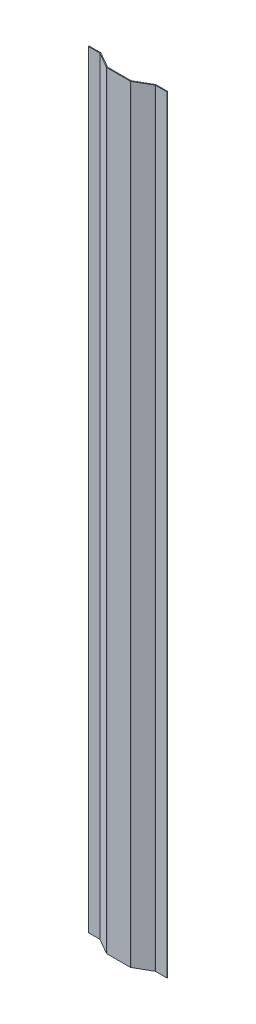
ISO-10303-21;
HEADER;
FILE_DESCRIPTION(('STEP AP214'),'2;1');
FILE_NAME('part.step','',(''),(''),'','','');
FILE_SCHEMA(('AUTOMOTIVE_DESIGN { 1 0 10303 214 1 1 1 1 }'));
ENDSEC;
DATA;
#1=APPLICATION_CONTEXT('core data for automotive mechanical design processes');
#2=APPLICATION_PROTOCOL_DEFINITION('international standard','automotive_design',2000,#1);
#3=PRODUCT_CONTEXT('',#1,'mechanical');
#4=PRODUCT('Part','Part','',(#3));
#5=PRODUCT_RELATED_PRODUCT_CATEGORY('part','',(#4));
#6=PRODUCT_DEFINITION_FORMATION('','',#4);
#7=PRODUCT_DEFINITION_CONTEXT('part definition',#1,'design');
#8=PRODUCT_DEFINITION('design','',#6,#7);
#9=PRODUCT_DEFINITION_SHAPE('','',#8);
#10=(LENGTH_UNIT() NAMED_UNIT(*) SI_UNIT(.MILLI.,.METRE.));
#11=(NAMED_UNIT(*) PLANE_ANGLE_UNIT() SI_UNIT($,.RADIAN.));
#12=(NAMED_UNIT(*) SI_UNIT($,.STERADIAN.) SOLID_ANGLE_UNIT());
#13=UNCERTAINTY_MEASURE_WITH_UNIT(LENGTH_MEASURE(1.E-05),#10,'distance_accuracy_value','');
#14=(GEOMETRIC_REPRESENTATION_CONTEXT(3) GLOBAL_UNCERTAINTY_ASSIGNED_CONTEXT((#13)) GLOBAL_UNIT_ASSIGNED_CONTEXT((#10,
#11,#12)) REPRESENTATION_CONTEXT('',''));
#15=CARTESIAN_POINT('',(0.,0.,0.));
#16=DIRECTION('',(0.,0.,1.));
#17=DIRECTION('',(1.,0.,0.));
#18=AXIS2_PLACEMENT_3D('',#15,#16,#17);
#19=CARTESIAN_POINT('',(29.7990381056767,0.,0.));
#20=DIRECTION('',(0.,-1.,0.));
#21=DIRECTION('',(0.,0.,-1.));
#22=AXIS2_PLACEMENT_3D('',#19,#20,#21);
#23=PLANE('',#22);
#24=DIRECTION('',(0.,0.,1.));
#25=VECTOR('',#24,1.);
#26=CARTESIAN_POINT('',(29.7990381056767,0.,0.));
#27=LINE('',#26,#25);
#28=CARTESIAN_POINT('',(29.7990381056767,0.,0.));
#29=VERTEX_POINT('',#28);
#30=CARTESIAN_POINT('',(29.7990381056767,0.,2.));
#31=VERTEX_POINT('',#30);
#32=EDGE_CURVE('E11',#29,#31,#27,.T.);
#33=ORIENTED_EDGE('',*,*,#32,.F.);
#34=CARTESIAN_POINT('',(29.7990381056767,0.,-0.749999999999998));
#35=DIRECTION('',(0.,-1.,0.));
#36=DIRECTION('',(0.,0.,-1.));
#37=AXIS2_PLACEMENT_3D('',#34,#35,#36);
#38=CIRCLE('',#37,0.75);
#39=CARTESIAN_POINT('',(30.1740381056767,0.,-0.100480947161669));
#40=VERTEX_POINT('',#39);
#41=EDGE_CURVE('E342',#29,#40,#38,.F.);
#42=ORIENTED_EDGE('',*,*,#41,.T.);
#43=DIRECTION('',(-0.500000000000001,0.,-0.866025403784438));
#44=VECTOR('',#43,1.);
#45=CARTESIAN_POINT('',(31.1740381056767,0.,1.63156986040721));
#46=LINE('',#45,#44);
#47=CARTESIAN_POINT('',(31.1740381056767,0.,1.63156986040721));
#48=VERTEX_POINT('',#47);
#49=EDGE_CURVE('E44',#48,#40,#46,.T.);
#50=ORIENTED_EDGE('',*,*,#49,.F.);
#51=CARTESIAN_POINT('',(29.7990381056767,0.,-0.749999999999998));
#52=DIRECTION('',(0.,1.,0.));
#53=DIRECTION('',(1.,0.,0.));
#54=AXIS2_PLACEMENT_3D('',#51,#52,#53);
#55=CIRCLE('',#54,2.75);
#56=EDGE_CURVE('E351',#31,#48,#55,.T.);
#57=ORIENTED_EDGE('',*,*,#56,.F.);
#58=EDGE_LOOP('',(#33,#42,#50,#57));
#59=FACE_BOUND('',#58,.T.);
#60=ADVANCED_FACE('F37',(#59),#23,.T.);
#61=CARTESIAN_POINT('',(31.1740381056767,0.,1.63156986040721));
#62=DIRECTION('',(0.,-1.,0.));
#63=DIRECTION('',(0.,0.,-1.));
#64=AXIS2_PLACEMENT_3D('',#61,#62,#63);
#65=PLANE('',#64);
#66=DIRECTION('',(1.,0.,0.));
#67=VECTOR('',#66,1.);
#68=CARTESIAN_POINT('',(0.,0.,0.));
#69=LINE('',#68,#67);
#70=CARTESIAN_POINT('',(-29.7990381056767,0.,0.));
#71=VERTEX_POINT('',#70);
#72=EDGE_CURVE('E345',#71,#29,#69,.T.);
#73=ORIENTED_EDGE('',*,*,#72,.T.);
#74=ORIENTED_EDGE('',*,*,#32,.T.);
#75=DIRECTION('',(1.,0.,0.));
#76=VECTOR('',#75,1.);
#77=CARTESIAN_POINT('',(0.,0.,2.));
#78=LINE('',#77,#76);
#79=CARTESIAN_POINT('',(-29.7990381056767,0.,2.));
#80=VERTEX_POINT('',#79);
#81=EDGE_CURVE('E348',#80,#31,#78,.T.);
#82=ORIENTED_EDGE('',*,*,#81,.F.);
#83=DIRECTION('',(0.,0.,1.));
#84=VECTOR('',#83,1.);
#85=CARTESIAN_POINT('',(-29.7990381056767,0.,0.));
#86=LINE('',#85,#84);
#87=EDGE_CURVE('E326',#71,#80,#86,.T.);
#88=ORIENTED_EDGE('',*,*,#87,.F.);
#89=EDGE_LOOP('',(#73,#74,#82,#88));
#90=FACE_BOUND('',#89,.T.);
#91=ADVANCED_FACE('F457',(#90),#65,.T.);
#92=CARTESIAN_POINT('',(69.1990288532697,0.,-22.6315698604072));
#93=DIRECTION('',(0.,-1.,0.));
#94=DIRECTION('',(0.,0.,-1.));
#95=AXIS2_PLACEMENT_3D('',#92,#93,#94);
#96=PLANE('',#95);
#97=DIRECTION('',(0.500000000000002,0.,0.866025403784438));
#98=VECTOR('',#97,1.);
#99=CARTESIAN_POINT('',(69.1990288532697,0.,-22.6315698604072));
#100=LINE('',#99,#98);
#101=CARTESIAN_POINT('',(69.1990288532697,0.,-22.6315698604072));
#102=VERTEX_POINT('',#101);
#103=CARTESIAN_POINT('',(70.1990288532697,0.,-20.8995190528383));
#104=VERTEX_POINT('',#103);
#105=EDGE_CURVE('E59',#102,#104,#100,.T.);
#106=ORIENTED_EDGE('',*,*,#105,.F.);
#107=CARTESIAN_POINT('',(70.5740288532697,0.,-20.25));
#108=DIRECTION('',(0.,1.,0.));
#109=DIRECTION('',(0.,0.,1.));
#110=AXIS2_PLACEMENT_3D('',#107,#108,#109);
#111=CIRCLE('',#110,2.75);
#112=CARTESIAN_POINT('',(70.5740288532697,0.,-23.));
#113=VERTEX_POINT('',#112);
#114=EDGE_CURVE('E338',#102,#113,#111,.F.);
#115=ORIENTED_EDGE('',*,*,#114,.T.);
#116=DIRECTION('',(0.,0.,-1.));
#117=VECTOR('',#116,1.);
#118=CARTESIAN_POINT('',(70.5740288532697,0.,-21.));
#119=LINE('',#118,#117);
#120=CARTESIAN_POINT('',(70.5740288532697,0.,-21.));
#121=VERTEX_POINT('',#120);
#122=EDGE_CURVE('E51',#121,#113,#119,.T.);
#123=ORIENTED_EDGE('',*,*,#122,.F.);
#124=CARTESIAN_POINT('',(70.5740288532697,0.,-20.25));
#125=DIRECTION('',(0.,1.,0.));
#126=DIRECTION('',(1.,0.,0.));
#127=AXIS2_PLACEMENT_3D('',#124,#125,#126);
#128=CIRCLE('',#127,0.75);
#129=EDGE_CURVE('E357',#104,#121,#128,.F.);
#130=ORIENTED_EDGE('',*,*,#129,.F.);
#131=EDGE_LOOP('',(#106,#115,#123,#130));
#132=FACE_BOUND('',#131,.T.);
#133=ADVANCED_FACE('F430',(#132),#96,.T.);
#134=CARTESIAN_POINT('',(70.5740288532697,0.,-21.));
#135=DIRECTION('',(0.,-1.,0.));
#136=DIRECTION('',(0.,0.,-1.));
#137=AXIS2_PLACEMENT_3D('',#134,#135,#136);
#138=PLANE('',#137);
#139=DIRECTION('',(0.866025403784438,0.,-0.500000000000001));
#140=VECTOR('',#139,1.);
#141=CARTESIAN_POINT('',(30.,0.,0.));
#142=LINE('',#141,#140);
#143=EDGE_CURVE('E340',#40,#102,#142,.T.);
#144=ORIENTED_EDGE('',*,*,#143,.T.);
#145=ORIENTED_EDGE('',*,*,#105,.T.);
#146=DIRECTION('',(0.866025403784438,0.,-0.500000000000001));
#147=VECTOR('',#146,1.);
#148=CARTESIAN_POINT('',(31.,0.,1.73205080756888));
#149=LINE('',#148,#147);
#150=EDGE_CURVE('E354',#48,#104,#149,.T.);
#151=ORIENTED_EDGE('',*,*,#150,.F.);
#152=ORIENTED_EDGE('',*,*,#49,.T.);
#153=EDGE_LOOP('',(#144,#145,#151,#152));
#154=FACE_BOUND('',#153,.T.);
#155=ADVANCED_FACE('F387',(#154),#138,.T.);
#156=CARTESIAN_POINT('',(69.8371685740841,1077.91967853083,-21.));
#157=DIRECTION('',(0.,0.,-1.));
#158=DIRECTION('',(-1.,0.,0.));
#159=AXIS2_PLACEMENT_3D('',#156,#157,#158);
#160=PLANE('',#159);
#161=DIRECTION('',(0.,-1.,0.));
#162=VECTOR('',#161,1.);
#163=CARTESIAN_POINT('',(99.8371685740841,1077.91967853083,-21.));
#164=LINE('',#163,#162);
#165=CARTESIAN_POINT('',(99.8371685740841,1950.,-21.));
#166=VERTEX_POINT('',#165);
#167=CARTESIAN_POINT('',(99.8371685740841,0.,-21.));
#168=VERTEX_POINT('',#167);
#169=EDGE_CURVE('E384',#166,#168,#164,.T.);
#170=ORIENTED_EDGE('',*,*,#169,.F.);
#171=DIRECTION('',(1.,0.,0.));
#172=VECTOR('',#171,1.);
#173=CARTESIAN_POINT('',(69.8371685740841,1950.,-21.));
#174=LINE('',#173,#172);
#175=CARTESIAN_POINT('',(70.5740288532697,1950.,-21.));
#176=VERTEX_POINT('',#175);
#177=EDGE_CURVE('E231',#176,#166,#174,.T.);
#178=ORIENTED_EDGE('',*,*,#177,.F.);
#179=DIRECTION('',(0.,-1.,0.));
#180=VECTOR('',#179,1.);
#181=CARTESIAN_POINT('',(70.5740288532697,1077.91967853083,-21.));
#182=LINE('',#181,#180);
#183=EDGE_CURVE('E360',#176,#121,#182,.T.);
#184=ORIENTED_EDGE('',*,*,#183,.T.);
#185=DIRECTION('',(1.,0.,0.));
#186=VECTOR('',#185,1.);
#187=CARTESIAN_POINT('',(69.8371685740841,0.,-21.));
#188=LINE('',#187,#186);
#189=EDGE_CURVE('E329',#121,#168,#188,.T.);
#190=ORIENTED_EDGE('',*,*,#189,.T.);
#191=EDGE_LOOP('',(#170,#178,#184,#190));
#192=FACE_BOUND('',#191,.T.);
#193=ADVANCED_FACE('F439',(#192),#160,.F.);
#194=CARTESIAN_POINT('',(99.8371685740841,1077.91967853083,-23.));
#195=DIRECTION('',(1.,0.,0.));
#196=DIRECTION('',(0.,0.,-1.));
#197=AXIS2_PLACEMENT_3D('',#194,#195,#196);
#198=PLANE('',#197);
#199=DIRECTION('',(0.,-1.,0.));
#200=VECTOR('',#199,1.);
#201=CARTESIAN_POINT('',(99.8371685740841,1077.91967853083,-23.));
#202=LINE('',#201,#200);
#203=CARTESIAN_POINT('',(99.8371685740841,1950.,-23.));
#204=VERTEX_POINT('',#203);
#205=CARTESIAN_POINT('',(99.8371685740841,0.,-23.));
#206=VERTEX_POINT('',#205);
#207=EDGE_CURVE('E382',#204,#206,#202,.T.);
#208=ORIENTED_EDGE('',*,*,#207,.F.);
#209=DIRECTION('',(0.,0.,1.));
#210=VECTOR('',#209,1.);
#211=CARTESIAN_POINT('',(99.8371685740841,1950.,-23.));
#212=LINE('',#211,#210);
#213=EDGE_CURVE('E234',#204,#166,#212,.T.);
#214=ORIENTED_EDGE('',*,*,#213,.T.);
#215=ORIENTED_EDGE('',*,*,#169,.T.);
#216=DIRECTION('',(0.,0.,1.));
#217=VECTOR('',#216,1.);
#218=CARTESIAN_POINT('',(99.8371685740841,0.,-23.));
#219=LINE('',#218,#217);
#220=EDGE_CURVE('E332',#206,#168,#219,.T.);
#221=ORIENTED_EDGE('',*,*,#220,.F.);
#222=EDGE_LOOP('',(#208,#214,#215,#221));
#223=FACE_BOUND('',#222,.T.);
#224=ADVANCED_FACE('F447',(#223),#198,.T.);
#225=CARTESIAN_POINT('',(69.8371685740841,1077.91967853083,-23.));
#226=DIRECTION('',(0.,0.,-1.));
#227=DIRECTION('',(-1.,0.,0.));
#228=AXIS2_PLACEMENT_3D('',#225,#226,#227);
#229=PLANE('',#228);
#230=DIRECTION('',(0.,-1.,0.));
#231=VECTOR('',#230,1.);
#232=CARTESIAN_POINT('',(70.5740288532697,1077.91967853083,-23.));
#233=LINE('',#232,#231);
#234=CARTESIAN_POINT('',(70.5740288532697,1950.,-23.));
#235=VERTEX_POINT('',#234);
#236=EDGE_CURVE('E379',#235,#113,#233,.T.);
#237=ORIENTED_EDGE('',*,*,#236,.F.);
#238=DIRECTION('',(1.,0.,0.));
#239=VECTOR('',#238,1.);
#240=CARTESIAN_POINT('',(69.8371685740841,1950.,-23.));
#241=LINE('',#240,#239);
#242=EDGE_CURVE('E237',#235,#204,#241,.T.);
#243=ORIENTED_EDGE('',*,*,#242,.T.);
#244=ORIENTED_EDGE('',*,*,#207,.T.);
#245=DIRECTION('',(1.,0.,0.));
#246=VECTOR('',#245,1.);
#247=CARTESIAN_POINT('',(69.8371685740841,0.,-23.));
#248=LINE('',#247,#246);
#249=EDGE_CURVE('E335',#113,#206,#248,.T.);
#250=ORIENTED_EDGE('',*,*,#249,.F.);
#251=EDGE_LOOP('',(#237,#243,#244,#250));
#252=FACE_BOUND('',#251,.T.);
#253=ADVANCED_FACE('F445',(#252),#229,.T.);
#254=CARTESIAN_POINT('',(70.5740288532697,1077.91967853083,-20.25));
#255=DIRECTION('',(0.,-1.,0.));
#256=DIRECTION('',(0.,0.,-1.));
#257=AXIS2_PLACEMENT_3D('',#254,#255,#256);
#258=CYLINDRICAL_SURFACE('',#257,2.75);
#259=DIRECTION('',(0.,-1.,0.));
#260=VECTOR('',#259,1.);
#261=CARTESIAN_POINT('',(69.1990288532697,1077.91967853083,-22.6315698604072));
#262=LINE('',#261,#260);
#263=CARTESIAN_POINT('',(69.1990288532697,1950.,-22.6315698604072));
#264=VERTEX_POINT('',#263);
#265=EDGE_CURVE('E376',#264,#102,#262,.T.);
#266=ORIENTED_EDGE('',*,*,#265,.F.);
#267=CARTESIAN_POINT('',(70.5740288532697,1950.,-20.25));
#268=DIRECTION('',(0.,1.,0.));
#269=DIRECTION('',(0.,0.,1.));
#270=AXIS2_PLACEMENT_3D('',#267,#268,#269);
#271=CIRCLE('',#270,2.75);
#272=EDGE_CURVE('E240',#264,#235,#271,.F.);
#273=ORIENTED_EDGE('',*,*,#272,.T.);
#274=ORIENTED_EDGE('',*,*,#236,.T.);
#275=ORIENTED_EDGE('',*,*,#114,.F.);
#276=EDGE_LOOP('',(#266,#273,#274,#275));
#277=FACE_BOUND('',#276,.T.);
#278=ADVANCED_FACE('F428',(#277),#258,.T.);
#279=CARTESIAN_POINT('',(30.,1077.91967853083,0.));
#280=DIRECTION('',(-0.500000000000001,0.,-0.866025403784438));
#281=DIRECTION('',(-0.866025403784438,0.,0.500000000000001));
#282=AXIS2_PLACEMENT_3D('',#279,#280,#281);
#283=PLANE('',#282);
#284=DIRECTION('',(0.,-1.,0.));
#285=VECTOR('',#284,1.);
#286=CARTESIAN_POINT('',(30.1740381056767,1077.91967853083,-0.100480947161669));
#287=LINE('',#286,#285);
#288=CARTESIAN_POINT('',(30.1740381056767,1950.,-0.100480947161669));
#289=VERTEX_POINT('',#288);
#290=EDGE_CURVE('E373',#289,#40,#287,.T.);
#291=ORIENTED_EDGE('',*,*,#290,.F.);
#292=DIRECTION('',(0.866025403784438,0.,-0.500000000000001));
#293=VECTOR('',#292,1.);
#294=CARTESIAN_POINT('',(30.,1950.,0.));
#295=LINE('',#294,#293);
#296=EDGE_CURVE('E243',#289,#264,#295,.T.);
#297=ORIENTED_EDGE('',*,*,#296,.T.);
#298=ORIENTED_EDGE('',*,*,#265,.T.);
#299=ORIENTED_EDGE('',*,*,#143,.F.);
#300=EDGE_LOOP('',(#291,#297,#298,#299));
#301=FACE_BOUND('',#300,.T.);
#302=ADVANCED_FACE('F397',(#301),#283,.T.);
#303=CARTESIAN_POINT('',(29.7990381056767,1077.91967853083,-0.749999999999998));
#304=DIRECTION('',(0.,-1.,0.));
#305=DIRECTION('',(0.,0.,-1.));
#306=AXIS2_PLACEMENT_3D('',#303,#304,#305);
#307=CYLINDRICAL_SURFACE('',#306,0.75);
#308=DIRECTION('',(0.,-1.,0.));
#309=VECTOR('',#308,1.);
#310=CARTESIAN_POINT('',(29.7990381056767,1077.91967853083,0.));
#311=LINE('',#310,#309);
#312=CARTESIAN_POINT('',(29.7990381056767,1950.,0.));
#313=VERTEX_POINT('',#312);
#314=EDGE_CURVE('E370',#313,#29,#311,.T.);
#315=ORIENTED_EDGE('',*,*,#314,.F.);
#316=CARTESIAN_POINT('',(29.7990381056767,1950.,-0.749999999999998));
#317=DIRECTION('',(0.,-1.,0.));
#318=DIRECTION('',(0.,0.,-1.));
#319=AXIS2_PLACEMENT_3D('',#316,#317,#318);
#320=CIRCLE('',#319,0.75);
#321=EDGE_CURVE('E246',#313,#289,#320,.F.);
#322=ORIENTED_EDGE('',*,*,#321,.T.);
#323=ORIENTED_EDGE('',*,*,#290,.T.);
#324=ORIENTED_EDGE('',*,*,#41,.F.);
#325=EDGE_LOOP('',(#315,#322,#323,#324));
#326=FACE_BOUND('',#325,.T.);
#327=ADVANCED_FACE('F393',(#326),#307,.F.);
#328=CARTESIAN_POINT('',(0.,1077.91967853083,0.));
#329=DIRECTION('',(0.,0.,-1.));
#330=DIRECTION('',(-1.,0.,0.));
#331=AXIS2_PLACEMENT_3D('',#328,#329,#330);
#332=PLANE('',#331);
#333=ORIENTED_EDGE('',*,*,#72,.F.);
#334=DIRECTION('',(0.,-1.,0.));
#335=VECTOR('',#334,1.);
#336=CARTESIAN_POINT('',(-29.7990381056767,1077.91967853083,0.));
#337=LINE('',#336,#335);
#338=CARTESIAN_POINT('',(-29.7990381056767,1950.,0.));
#339=VERTEX_POINT('',#338);
#340=EDGE_CURVE('E307',#339,#71,#337,.T.);
#341=ORIENTED_EDGE('',*,*,#340,.F.);
#342=DIRECTION('',(1.,0.,0.));
#343=VECTOR('',#342,1.);
#344=CARTESIAN_POINT('',(0.,1950.,0.));
#345=LINE('',#344,#343);
#346=EDGE_CURVE('E249',#339,#313,#345,.T.);
#347=ORIENTED_EDGE('',*,*,#346,.T.);
#348=ORIENTED_EDGE('',*,*,#314,.T.);
#349=EDGE_LOOP('',(#333,#341,#347,#348));
#350=FACE_BOUND('',#349,.T.);
#351=ADVANCED_FACE('F401',(#350),#332,.T.);
#352=CARTESIAN_POINT('',(0.,1077.91967853083,2.));
#353=DIRECTION('',(0.,0.,-1.));
#354=DIRECTION('',(-1.,0.,0.));
#355=AXIS2_PLACEMENT_3D('',#352,#353,#354);
#356=PLANE('',#355);
#357=DIRECTION('',(0.,-1.,0.));
#358=VECTOR('',#357,1.);
#359=CARTESIAN_POINT('',(29.7990381056767,1077.91967853083,2.));
#360=LINE('',#359,#358);
#361=CARTESIAN_POINT('',(29.7990381056767,1950.,2.));
#362=VERTEX_POINT('',#361);
#363=EDGE_CURVE('E367',#362,#31,#360,.T.);
#364=ORIENTED_EDGE('',*,*,#363,.F.);
#365=DIRECTION('',(1.,0.,0.));
#366=VECTOR('',#365,1.);
#367=CARTESIAN_POINT('',(0.,1950.,2.));
#368=LINE('',#367,#366);
#369=CARTESIAN_POINT('',(-29.7990381056767,1950.,2.));
#370=VERTEX_POINT('',#369);
#371=EDGE_CURVE('E252',#370,#362,#368,.T.);
#372=ORIENTED_EDGE('',*,*,#371,.F.);
#373=DIRECTION('',(0.,-1.,0.));
#374=VECTOR('',#373,1.);
#375=CARTESIAN_POINT('',(-29.7990381056767,1077.91967853083,2.));
#376=LINE('',#375,#374);
#377=EDGE_CURVE('E304',#370,#80,#376,.T.);
#378=ORIENTED_EDGE('',*,*,#377,.T.);
#379=ORIENTED_EDGE('',*,*,#81,.T.);
#380=EDGE_LOOP('',(#364,#372,#378,#379));
#381=FACE_BOUND('',#380,.T.);
#382=ADVANCED_FACE('F533',(#381),#356,.F.);
#383=CARTESIAN_POINT('',(29.7990381056767,1077.91967853083,-0.749999999999998));
#384=DIRECTION('',(0.,-1.,0.));
#385=DIRECTION('',(0.,0.,-1.));
#386=AXIS2_PLACEMENT_3D('',#383,#384,#385);
#387=CYLINDRICAL_SURFACE('',#386,2.75);
#388=DIRECTION('',(0.,-1.,0.));
#389=VECTOR('',#388,1.);
#390=CARTESIAN_POINT('',(31.1740381056767,1077.91967853083,1.63156986040721));
#391=LINE('',#390,#389);
#392=CARTESIAN_POINT('',(31.1740381056767,1950.,1.63156986040721));
#393=VERTEX_POINT('',#392);
#394=EDGE_CURVE('E364',#393,#48,#391,.T.);
#395=ORIENTED_EDGE('',*,*,#394,.F.);
#396=CARTESIAN_POINT('',(29.7990381056767,1950.,-0.749999999999998));
#397=DIRECTION('',(0.,1.,0.));
#398=DIRECTION('',(1.,0.,0.));
#399=AXIS2_PLACEMENT_3D('',#396,#397,#398);
#400=CIRCLE('',#399,2.75);
#401=EDGE_CURVE('E255',#362,#393,#400,.T.);
#402=ORIENTED_EDGE('',*,*,#401,.F.);
#403=ORIENTED_EDGE('',*,*,#363,.T.);
#404=ORIENTED_EDGE('',*,*,#56,.T.);
#405=EDGE_LOOP('',(#395,#402,#403,#404));
#406=FACE_BOUND('',#405,.T.);
#407=ADVANCED_FACE('F415',(#406),#387,.T.);
#408=CARTESIAN_POINT('',(31.,1077.91967853083,1.73205080756888));
#409=DIRECTION('',(-0.500000000000001,0.,-0.866025403784438));
#410=DIRECTION('',(-0.866025403784438,0.,0.500000000000001));
#411=AXIS2_PLACEMENT_3D('',#408,#409,#410);
#412=PLANE('',#411);
#413=DIRECTION('',(0.,-1.,0.));
#414=VECTOR('',#413,1.);
#415=CARTESIAN_POINT('',(70.1990288532697,1077.91967853083,-20.8995190528383));
#416=LINE('',#415,#414);
#417=CARTESIAN_POINT('',(70.1990288532697,1950.,-20.8995190528383));
#418=VERTEX_POINT('',#417);
#419=EDGE_CURVE('E362',#418,#104,#416,.T.);
#420=ORIENTED_EDGE('',*,*,#419,.F.);
#421=DIRECTION('',(0.866025403784438,0.,-0.500000000000001));
#422=VECTOR('',#421,1.);
#423=CARTESIAN_POINT('',(31.,1950.,1.73205080756888));
#424=LINE('',#423,#422);
#425=EDGE_CURVE('E258',#393,#418,#424,.T.);
#426=ORIENTED_EDGE('',*,*,#425,.F.);
#427=ORIENTED_EDGE('',*,*,#394,.T.);
#428=ORIENTED_EDGE('',*,*,#150,.T.);
#429=EDGE_LOOP('',(#420,#426,#427,#428));
#430=FACE_BOUND('',#429,.T.);
#431=ADVANCED_FACE('F418',(#430),#412,.F.);
#432=CARTESIAN_POINT('',(70.5740288532697,1077.91967853083,-20.25));
#433=DIRECTION('',(0.,-1.,0.));
#434=DIRECTION('',(0.,0.,-1.));
#435=AXIS2_PLACEMENT_3D('',#432,#433,#434);
#436=CYLINDRICAL_SURFACE('',#435,0.75);
#437=ORIENTED_EDGE('',*,*,#183,.F.);
#438=CARTESIAN_POINT('',(70.5740288532697,1950.,-20.25));
#439=DIRECTION('',(0.,1.,0.));
#440=DIRECTION('',(1.,0.,0.));
#441=AXIS2_PLACEMENT_3D('',#438,#439,#440);
#442=CIRCLE('',#441,0.75);
#443=EDGE_CURVE('E261',#418,#176,#442,.F.);
#444=ORIENTED_EDGE('',*,*,#443,.F.);
#445=ORIENTED_EDGE('',*,*,#419,.T.);
#446=ORIENTED_EDGE('',*,*,#129,.T.);
#447=EDGE_LOOP('',(#437,#444,#445,#446));
#448=FACE_BOUND('',#447,.T.);
#449=ADVANCED_FACE('F433',(#448),#436,.F.);
#450=CARTESIAN_POINT('',(70.5740288532697,0.,-20.25));
#451=DIRECTION('',(0.,1.,0.));
#452=DIRECTION('',(1.,0.,0.));
#453=AXIS2_PLACEMENT_3D('',#450,#451,#452);
#454=PLANE('',#453);
#455=ORIENTED_EDGE('',*,*,#189,.F.);
#456=ORIENTED_EDGE('',*,*,#122,.T.);
#457=ORIENTED_EDGE('',*,*,#249,.T.);
#458=ORIENTED_EDGE('',*,*,#220,.T.);
#459=EDGE_LOOP('',(#455,#456,#457,#458));
#460=FACE_BOUND('',#459,.T.);
#461=ADVANCED_FACE('F436',(#460),#454,.F.);
#462=CARTESIAN_POINT('',(-29.7990381056767,0.,0.));
#463=DIRECTION('',(0.,-1.,0.));
#464=DIRECTION('',(0.,0.,-1.));
#465=AXIS2_PLACEMENT_3D('',#462,#463,#464);
#466=PLANE('',#465);
#467=ORIENTED_EDGE('',*,*,#87,.T.);
#468=CARTESIAN_POINT('',(-29.7990381056767,0.,-0.749999999999998));
#469=DIRECTION('',(0.,-1.,0.));
#470=DIRECTION('',(-1.,0.,0.));
#471=AXIS2_PLACEMENT_3D('',#468,#469,#470);
#472=CIRCLE('',#471,2.75);
#473=CARTESIAN_POINT('',(-31.1740381056767,0.,1.63156986040721));
#474=VERTEX_POINT('',#473);
#475=EDGE_CURVE('E290',#80,#474,#472,.T.);
#476=ORIENTED_EDGE('',*,*,#475,.T.);
#477=DIRECTION('',(0.500000000000001,0.,-0.866025403784438));
#478=VECTOR('',#477,1.);
#479=CARTESIAN_POINT('',(-31.1740381056767,0.,1.63156986040721));
#480=LINE('',#479,#478);
#481=CARTESIAN_POINT('',(-30.1740381056767,0.,-0.100480947161669));
#482=VERTEX_POINT('',#481);
#483=EDGE_CURVE('E323',#474,#482,#480,.T.);
#484=ORIENTED_EDGE('',*,*,#483,.T.);
#485=CARTESIAN_POINT('',(-29.7990381056767,0.,-0.749999999999998));
#486=DIRECTION('',(0.,1.,0.));
#487=DIRECTION('',(0.,0.,-1.));
#488=AXIS2_PLACEMENT_3D('',#485,#486,#487);
#489=CIRCLE('',#488,0.75);
#490=EDGE_CURVE('E287',#71,#482,#489,.F.);
#491=ORIENTED_EDGE('',*,*,#490,.F.);
#492=EDGE_LOOP('',(#467,#476,#484,#491));
#493=FACE_BOUND('',#492,.T.);
#494=ADVANCED_FACE('F765',(#493),#466,.T.);
#495=CARTESIAN_POINT('',(-69.1990288532697,0.,-22.6315698604072));
#496=DIRECTION('',(0.,-1.,0.));
#497=DIRECTION('',(0.,0.,-1.));
#498=AXIS2_PLACEMENT_3D('',#495,#496,#497);
#499=PLANE('',#498);
#500=DIRECTION('',(-0.500000000000002,0.,0.866025403784438));
#501=VECTOR('',#500,1.);
#502=CARTESIAN_POINT('',(-69.1990288532697,0.,-22.6315698604072));
#503=LINE('',#502,#501);
#504=CARTESIAN_POINT('',(-69.1990288532697,0.,-22.6315698604072));
#505=VERTEX_POINT('',#504);
#506=CARTESIAN_POINT('',(-70.1990288532697,0.,-20.8995190528383));
#507=VERTEX_POINT('',#506);
#508=EDGE_CURVE('E320',#505,#507,#503,.T.);
#509=ORIENTED_EDGE('',*,*,#508,.T.);
#510=CARTESIAN_POINT('',(-70.5740288532697,0.,-20.25));
#511=DIRECTION('',(0.,-1.,0.));
#512=DIRECTION('',(-1.,0.,0.));
#513=AXIS2_PLACEMENT_3D('',#510,#511,#512);
#514=CIRCLE('',#513,0.75);
#515=CARTESIAN_POINT('',(-70.5740288532697,0.,-21.));
#516=VERTEX_POINT('',#515);
#517=EDGE_CURVE('E296',#507,#516,#514,.F.);
#518=ORIENTED_EDGE('',*,*,#517,.T.);
#519=DIRECTION('',(0.,0.,-1.));
#520=VECTOR('',#519,1.);
#521=CARTESIAN_POINT('',(-70.5740288532697,0.,-21.));
#522=LINE('',#521,#520);
#523=CARTESIAN_POINT('',(-70.5740288532697,0.,-23.));
#524=VERTEX_POINT('',#523);
#525=EDGE_CURVE('E185',#516,#524,#522,.T.);
#526=ORIENTED_EDGE('',*,*,#525,.T.);
#527=CARTESIAN_POINT('',(-70.5740288532697,0.,-20.25));
#528=DIRECTION('',(0.,-1.,0.));
#529=DIRECTION('',(0.,0.,1.));
#530=AXIS2_PLACEMENT_3D('',#527,#528,#529);
#531=CIRCLE('',#530,2.75);
#532=EDGE_CURVE('E281',#505,#524,#531,.F.);
#533=ORIENTED_EDGE('',*,*,#532,.F.);
#534=EDGE_LOOP('',(#509,#518,#526,#533));
#535=FACE_BOUND('',#534,.T.);
#536=ADVANCED_FACE('F761',(#535),#499,.T.);
#537=CARTESIAN_POINT('',(-70.5740288532697,0.,-21.));
#538=DIRECTION('',(0.,-1.,0.));
#539=DIRECTION('',(0.,0.,-1.));
#540=AXIS2_PLACEMENT_3D('',#537,#538,#539);
#541=PLANE('',#540);
#542=DIRECTION('',(-0.866025403784438,0.,-0.500000000000001));
#543=VECTOR('',#542,1.);
#544=CARTESIAN_POINT('',(-30.,0.,0.));
#545=LINE('',#544,#543);
#546=EDGE_CURVE('E284',#482,#505,#545,.T.);
#547=ORIENTED_EDGE('',*,*,#546,.F.);
#548=ORIENTED_EDGE('',*,*,#483,.F.);
#549=DIRECTION('',(-0.866025403784438,0.,-0.500000000000001));
#550=VECTOR('',#549,1.);
#551=CARTESIAN_POINT('',(-31.,0.,1.73205080756888));
#552=LINE('',#551,#550);
#553=EDGE_CURVE('E293',#474,#507,#552,.T.);
#554=ORIENTED_EDGE('',*,*,#553,.T.);
#555=ORIENTED_EDGE('',*,*,#508,.F.);
#556=EDGE_LOOP('',(#547,#548,#554,#555));
#557=FACE_BOUND('',#556,.T.);
#558=ADVANCED_FACE('F581',(#557),#541,.T.);
#559=CARTESIAN_POINT('',(-69.8371685740841,1077.91967853083,-21.));
#560=DIRECTION('',(0.,0.,-1.));
#561=DIRECTION('',(1.,0.,0.));
#562=AXIS2_PLACEMENT_3D('',#559,#560,#561);
#563=PLANE('',#562);
#564=DIRECTION('',(0.,-1.,0.));
#565=VECTOR('',#564,1.);
#566=CARTESIAN_POINT('',(-70.5740288532697,1077.91967853083,-21.));
#567=LINE('',#566,#565);
#568=CARTESIAN_POINT('',(-70.5740288532697,1950.,-21.));
#569=VERTEX_POINT('',#568);
#570=EDGE_CURVE('E199',#569,#516,#567,.T.);
#571=ORIENTED_EDGE('',*,*,#570,.F.);
#572=DIRECTION('',(-1.,0.,0.));
#573=VECTOR('',#572,1.);
#574=CARTESIAN_POINT('',(-69.8371685740841,1950.,-21.));
#575=LINE('',#574,#573);
#576=CARTESIAN_POINT('',(-99.8371685740841,1950.,-21.));
#577=VERTEX_POINT('',#576);
#578=EDGE_CURVE('E193',#569,#577,#575,.T.);
#579=ORIENTED_EDGE('',*,*,#578,.T.);
#580=DIRECTION('',(0.,-1.,0.));
#581=VECTOR('',#580,1.);
#582=CARTESIAN_POINT('',(-99.8371685740841,1077.91967853083,-21.));
#583=LINE('',#582,#581);
#584=CARTESIAN_POINT('',(-99.8371685740841,0.,-21.));
#585=VERTEX_POINT('',#584);
#586=EDGE_CURVE('E174',#577,#585,#583,.T.);
#587=ORIENTED_EDGE('',*,*,#586,.T.);
#588=DIRECTION('',(-1.,0.,0.));
#589=VECTOR('',#588,1.);
#590=CARTESIAN_POINT('',(-69.8371685740841,0.,-21.));
#591=LINE('',#590,#589);
#592=EDGE_CURVE('E276',#516,#585,#591,.T.);
#593=ORIENTED_EDGE('',*,*,#592,.F.);
#594=EDGE_LOOP('',(#571,#579,#587,#593));
#595=FACE_BOUND('',#594,.T.);
#596=ADVANCED_FACE('F198',(#595),#563,.F.);
#597=CARTESIAN_POINT('',(-99.8371685740841,1077.91967853083,-23.));
#598=DIRECTION('',(-1.,0.,0.));
#599=DIRECTION('',(0.,0.,-1.));
#600=AXIS2_PLACEMENT_3D('',#597,#598,#599);
#601=PLANE('',#600);
#602=DIRECTION('',(0.,-1.,0.));
#603=VECTOR('',#602,1.);
#604=CARTESIAN_POINT('',(-99.8371685740841,1077.91967853083,-23.));
#605=LINE('',#604,#603);
#606=CARTESIAN_POINT('',(-99.8371685740841,1950.,-23.));
#607=VERTEX_POINT('',#606);
#608=CARTESIAN_POINT('',(-99.8371685740841,0.,-23.));
#609=VERTEX_POINT('',#608);
#610=EDGE_CURVE('E186',#607,#609,#605,.T.);
#611=ORIENTED_EDGE('',*,*,#610,.T.);
#612=DIRECTION('',(0.,0.,1.));
#613=VECTOR('',#612,1.);
#614=CARTESIAN_POINT('',(-99.8371685740841,0.,-23.));
#615=LINE('',#614,#613);
#616=EDGE_CURVE('E180',#609,#585,#615,.T.);
#617=ORIENTED_EDGE('',*,*,#616,.T.);
#618=ORIENTED_EDGE('',*,*,#586,.F.);
#619=DIRECTION('',(0.,0.,1.));
#620=VECTOR('',#619,1.);
#621=CARTESIAN_POINT('',(-99.8371685740841,1950.,-23.));
#622=LINE('',#621,#620);
#623=EDGE_CURVE('E178',#607,#577,#622,.T.);
#624=ORIENTED_EDGE('',*,*,#623,.F.);
#625=EDGE_LOOP('',(#611,#617,#618,#624));
#626=FACE_BOUND('',#625,.T.);
#627=ADVANCED_FACE('F177',(#626),#601,.T.);
#628=CARTESIAN_POINT('',(-69.8371685740841,1077.91967853083,-23.));
#629=DIRECTION('',(0.,0.,-1.));
#630=DIRECTION('',(1.,0.,0.));
#631=AXIS2_PLACEMENT_3D('',#628,#629,#630);
#632=PLANE('',#631);
#633=DIRECTION('',(0.,-1.,0.));
#634=VECTOR('',#633,1.);
#635=CARTESIAN_POINT('',(-70.5740288532697,1077.91967853083,-23.));
#636=LINE('',#635,#634);
#637=CARTESIAN_POINT('',(-70.5740288532697,1950.,-23.));
#638=VERTEX_POINT('',#637);
#639=EDGE_CURVE('E314',#638,#524,#636,.T.);
#640=ORIENTED_EDGE('',*,*,#639,.T.);
#641=DIRECTION('',(-1.,0.,0.));
#642=VECTOR('',#641,1.);
#643=CARTESIAN_POINT('',(-69.8371685740841,0.,-23.));
#644=LINE('',#643,#642);
#645=EDGE_CURVE('E279',#524,#609,#644,.T.);
#646=ORIENTED_EDGE('',*,*,#645,.T.);
#647=ORIENTED_EDGE('',*,*,#610,.F.);
#648=DIRECTION('',(-1.,0.,0.));
#649=VECTOR('',#648,1.);
#650=CARTESIAN_POINT('',(-69.8371685740841,1950.,-23.));
#651=LINE('',#650,#649);
#652=EDGE_CURVE('E196',#638,#607,#651,.T.);
#653=ORIENTED_EDGE('',*,*,#652,.F.);
#654=EDGE_LOOP('',(#640,#646,#647,#653));
#655=FACE_BOUND('',#654,.T.);
#656=ADVANCED_FACE('F592',(#655),#632,.T.);
#657=CARTESIAN_POINT('',(-70.5740288532697,1077.91967853083,-20.25));
#658=DIRECTION('',(0.,-1.,0.));
#659=DIRECTION('',(0.,0.,-1.));
#660=AXIS2_PLACEMENT_3D('',#657,#658,#659);
#661=CYLINDRICAL_SURFACE('',#660,2.75);
#662=DIRECTION('',(0.,-1.,0.));
#663=VECTOR('',#662,1.);
#664=CARTESIAN_POINT('',(-69.1990288532697,1077.91967853083,-22.6315698604072));
#665=LINE('',#664,#663);
#666=CARTESIAN_POINT('',(-69.1990288532697,1950.,-22.6315698604072));
#667=VERTEX_POINT('',#666);
#668=EDGE_CURVE('E312',#667,#505,#665,.T.);
#669=ORIENTED_EDGE('',*,*,#668,.T.);
#670=ORIENTED_EDGE('',*,*,#532,.T.);
#671=ORIENTED_EDGE('',*,*,#639,.F.);
#672=CARTESIAN_POINT('',(-70.5740288532697,1950.,-20.25));
#673=DIRECTION('',(0.,-1.,0.));
#674=DIRECTION('',(0.,0.,1.));
#675=AXIS2_PLACEMENT_3D('',#672,#673,#674);
#676=CIRCLE('',#675,2.75);
#677=EDGE_CURVE('E203',#667,#638,#676,.F.);
#678=ORIENTED_EDGE('',*,*,#677,.F.);
#679=EDGE_LOOP('',(#669,#670,#671,#678));
#680=FACE_BOUND('',#679,.T.);
#681=ADVANCED_FACE('F602',(#680),#661,.T.);
#682=CARTESIAN_POINT('',(-30.,1077.91967853083,0.));
#683=DIRECTION('',(0.500000000000001,0.,-0.866025403784438));
#684=DIRECTION('',(0.866025403784438,0.,0.500000000000001));
#685=AXIS2_PLACEMENT_3D('',#682,#683,#684);
#686=PLANE('',#685);
#687=DIRECTION('',(0.,-1.,0.));
#688=VECTOR('',#687,1.);
#689=CARTESIAN_POINT('',(-30.1740381056767,1077.91967853083,-0.100480947161669));
#690=LINE('',#689,#688);
#691=CARTESIAN_POINT('',(-30.1740381056767,1950.,-0.100480947161669));
#692=VERTEX_POINT('',#691);
#693=EDGE_CURVE('E310',#692,#482,#690,.T.);
#694=ORIENTED_EDGE('',*,*,#693,.T.);
#695=ORIENTED_EDGE('',*,*,#546,.T.);
#696=ORIENTED_EDGE('',*,*,#668,.F.);
#697=DIRECTION('',(-0.866025403784438,0.,-0.500000000000001));
#698=VECTOR('',#697,1.);
#699=CARTESIAN_POINT('',(-30.,1950.,0.));
#700=LINE('',#699,#698);
#701=EDGE_CURVE('E206',#692,#667,#700,.T.);
#702=ORIENTED_EDGE('',*,*,#701,.F.);
#703=EDGE_LOOP('',(#694,#695,#696,#702));
#704=FACE_BOUND('',#703,.T.);
#705=ADVANCED_FACE('F614',(#704),#686,.T.);
#706=CARTESIAN_POINT('',(-29.7990381056767,1077.91967853083,-0.749999999999998));
#707=DIRECTION('',(0.,-1.,0.));
#708=DIRECTION('',(0.,0.,-1.));
#709=AXIS2_PLACEMENT_3D('',#706,#707,#708);
#710=CYLINDRICAL_SURFACE('',#709,0.75);
#711=ORIENTED_EDGE('',*,*,#340,.T.);
#712=ORIENTED_EDGE('',*,*,#490,.T.);
#713=ORIENTED_EDGE('',*,*,#693,.F.);
#714=CARTESIAN_POINT('',(-29.7990381056767,1950.,-0.749999999999998));
#715=DIRECTION('',(0.,1.,0.));
#716=DIRECTION('',(0.,0.,-1.));
#717=AXIS2_PLACEMENT_3D('',#714,#715,#716);
#718=CIRCLE('',#717,0.75);
#719=EDGE_CURVE('E209',#339,#692,#718,.F.);
#720=ORIENTED_EDGE('',*,*,#719,.F.);
#721=EDGE_LOOP('',(#711,#712,#713,#720));
#722=FACE_BOUND('',#721,.T.);
#723=ADVANCED_FACE('F624',(#722),#710,.F.);
#724=CARTESIAN_POINT('',(-29.7990381056767,1077.91967853083,-0.749999999999998));
#725=DIRECTION('',(0.,-1.,0.));
#726=DIRECTION('',(0.,0.,-1.));
#727=AXIS2_PLACEMENT_3D('',#724,#725,#726);
#728=CYLINDRICAL_SURFACE('',#727,2.75);
#729=ORIENTED_EDGE('',*,*,#377,.F.);
#730=CARTESIAN_POINT('',(-29.7990381056767,1950.,-0.749999999999998));
#731=DIRECTION('',(0.,-1.,0.));
#732=DIRECTION('',(-1.,0.,0.));
#733=AXIS2_PLACEMENT_3D('',#730,#731,#732);
#734=CIRCLE('',#733,2.75);
#735=CARTESIAN_POINT('',(-31.1740381056767,1950.,1.63156986040721));
#736=VERTEX_POINT('',#735);
#737=EDGE_CURVE('E212',#370,#736,#734,.T.);
#738=ORIENTED_EDGE('',*,*,#737,.T.);
#739=DIRECTION('',(0.,-1.,0.));
#740=VECTOR('',#739,1.);
#741=CARTESIAN_POINT('',(-31.1740381056767,1077.91967853083,1.63156986040721));
#742=LINE('',#741,#740);
#743=EDGE_CURVE('E302',#736,#474,#742,.T.);
#744=ORIENTED_EDGE('',*,*,#743,.T.);
#745=ORIENTED_EDGE('',*,*,#475,.F.);
#746=EDGE_LOOP('',(#729,#738,#744,#745));
#747=FACE_BOUND('',#746,.T.);
#748=ADVANCED_FACE('F635',(#747),#728,.T.);
#749=CARTESIAN_POINT('',(-31.,1077.91967853083,1.73205080756888));
#750=DIRECTION('',(0.500000000000001,0.,-0.866025403784438));
#751=DIRECTION('',(0.866025403784438,0.,0.500000000000001));
#752=AXIS2_PLACEMENT_3D('',#749,#750,#751);
#753=PLANE('',#752);
#754=ORIENTED_EDGE('',*,*,#743,.F.);
#755=DIRECTION('',(-0.866025403784438,0.,-0.500000000000001));
#756=VECTOR('',#755,1.);
#757=CARTESIAN_POINT('',(-31.,1950.,1.73205080756888));
#758=LINE('',#757,#756);
#759=CARTESIAN_POINT('',(-70.1990288532697,1950.,-20.8995190528383));
#760=VERTEX_POINT('',#759);
#761=EDGE_CURVE('E215',#736,#760,#758,.T.);
#762=ORIENTED_EDGE('',*,*,#761,.T.);
#763=DIRECTION('',(0.,-1.,0.));
#764=VECTOR('',#763,1.);
#765=CARTESIAN_POINT('',(-70.1990288532697,1077.91967853083,-20.8995190528383));
#766=LINE('',#765,#764);
#767=EDGE_CURVE('E300',#760,#507,#766,.T.);
#768=ORIENTED_EDGE('',*,*,#767,.T.);
#769=ORIENTED_EDGE('',*,*,#553,.F.);
#770=EDGE_LOOP('',(#754,#762,#768,#769));
#771=FACE_BOUND('',#770,.T.);
#772=ADVANCED_FACE('F645',(#771),#753,.F.);
#773=CARTESIAN_POINT('',(-70.5740288532697,1077.91967853083,-20.25));
#774=DIRECTION('',(0.,-1.,0.));
#775=DIRECTION('',(0.,0.,-1.));
#776=AXIS2_PLACEMENT_3D('',#773,#774,#775);
#777=CYLINDRICAL_SURFACE('',#776,0.75);
#778=ORIENTED_EDGE('',*,*,#767,.F.);
#779=CARTESIAN_POINT('',(-70.5740288532697,1950.,-20.25));
#780=DIRECTION('',(0.,-1.,0.));
#781=DIRECTION('',(-1.,0.,0.));
#782=AXIS2_PLACEMENT_3D('',#779,#780,#781);
#783=CIRCLE('',#782,0.75);
#784=EDGE_CURVE('E218',#760,#569,#783,.F.);
#785=ORIENTED_EDGE('',*,*,#784,.T.);
#786=ORIENTED_EDGE('',*,*,#570,.T.);
#787=ORIENTED_EDGE('',*,*,#517,.F.);
#788=EDGE_LOOP('',(#778,#785,#786,#787));
#789=FACE_BOUND('',#788,.T.);
#790=ADVANCED_FACE('F655',(#789),#777,.F.);
#791=CARTESIAN_POINT('',(-70.5740288532697,0.,-20.25));
#792=DIRECTION('',(0.,1.,0.));
#793=DIRECTION('',(-1.,0.,0.));
#794=AXIS2_PLACEMENT_3D('',#791,#792,#793);
#795=PLANE('',#794);
#796=ORIENTED_EDGE('',*,*,#592,.T.);
#797=ORIENTED_EDGE('',*,*,#616,.F.);
#798=ORIENTED_EDGE('',*,*,#645,.F.);
#799=ORIENTED_EDGE('',*,*,#525,.F.);
#800=EDGE_LOOP('',(#796,#797,#798,#799));
#801=FACE_BOUND('',#800,.T.);
#802=ADVANCED_FACE('F484',(#801),#795,.F.);
#803=CARTESIAN_POINT('',(29.7990381056767,1950.,0.));
#804=DIRECTION('',(0.,1.,0.));
#805=DIRECTION('',(0.,0.,-1.));
#806=AXIS2_PLACEMENT_3D('',#803,#804,#805);
#807=PLANE('',#806);
#808=DIRECTION('',(0.,0.,1.));
#809=VECTOR('',#808,1.);
#810=CARTESIAN_POINT('',(29.7990381056767,1950.,0.));
#811=LINE('',#810,#809);
#812=EDGE_CURVE('E273',#313,#362,#811,.T.);
#813=ORIENTED_EDGE('',*,*,#812,.T.);
#814=ORIENTED_EDGE('',*,*,#401,.T.);
#815=DIRECTION('',(-0.500000000000001,0.,-0.866025403784438));
#816=VECTOR('',#815,1.);
#817=CARTESIAN_POINT('',(31.1740381056767,1950.,1.63156986040721));
#818=LINE('',#817,#816);
#819=EDGE_CURVE('E270',#393,#289,#818,.T.);
#820=ORIENTED_EDGE('',*,*,#819,.T.);
#821=ORIENTED_EDGE('',*,*,#321,.F.);
#822=EDGE_LOOP('',(#813,#814,#820,#821));
#823=FACE_BOUND('',#822,.T.);
#824=ADVANCED_FACE('F407',(#823),#807,.T.);
#825=CARTESIAN_POINT('',(31.1740381056767,1950.,1.63156986040721));
#826=DIRECTION('',(0.,1.,0.));
#827=DIRECTION('',(0.,0.,-1.));
#828=AXIS2_PLACEMENT_3D('',#825,#826,#827);
#829=PLANE('',#828);
#830=ORIENTED_EDGE('',*,*,#346,.F.);
#831=DIRECTION('',(0.,0.,1.));
#832=VECTOR('',#831,1.);
#833=CARTESIAN_POINT('',(-29.7990381056767,1950.,0.));
#834=LINE('',#833,#832);
#835=EDGE_CURVE('E228',#339,#370,#834,.T.);
#836=ORIENTED_EDGE('',*,*,#835,.T.);
#837=ORIENTED_EDGE('',*,*,#371,.T.);
#838=ORIENTED_EDGE('',*,*,#812,.F.);
#839=EDGE_LOOP('',(#830,#836,#837,#838));
#840=FACE_BOUND('',#839,.T.);
#841=ADVANCED_FACE('F409',(#840),#829,.T.);
#842=CARTESIAN_POINT('',(69.1990288532697,1950.,-22.6315698604072));
#843=DIRECTION('',(0.,1.,0.));
#844=DIRECTION('',(0.,0.,-1.));
#845=AXIS2_PLACEMENT_3D('',#842,#843,#844);
#846=PLANE('',#845);
#847=DIRECTION('',(0.500000000000002,0.,0.866025403784438));
#848=VECTOR('',#847,1.);
#849=CARTESIAN_POINT('',(69.1990288532697,1950.,-22.6315698604072));
#850=LINE('',#849,#848);
#851=EDGE_CURVE('E267',#264,#418,#850,.T.);
#852=ORIENTED_EDGE('',*,*,#851,.T.);
#853=ORIENTED_EDGE('',*,*,#443,.T.);
#854=DIRECTION('',(0.,0.,-1.));
#855=VECTOR('',#854,1.);
#856=CARTESIAN_POINT('',(70.5740288532697,1950.,-21.));
#857=LINE('',#856,#855);
#858=EDGE_CURVE('E264',#176,#235,#857,.T.);
#859=ORIENTED_EDGE('',*,*,#858,.T.);
#860=ORIENTED_EDGE('',*,*,#272,.F.);
#861=EDGE_LOOP('',(#852,#853,#859,#860));
#862=FACE_BOUND('',#861,.T.);
#863=ADVANCED_FACE('F425',(#862),#846,.T.);
#864=CARTESIAN_POINT('',(70.5740288532697,1950.,-21.));
#865=DIRECTION('',(0.,1.,0.));
#866=DIRECTION('',(0.,0.,-1.));
#867=AXIS2_PLACEMENT_3D('',#864,#865,#866);
#868=PLANE('',#867);
#869=ORIENTED_EDGE('',*,*,#296,.F.);
#870=ORIENTED_EDGE('',*,*,#819,.F.);
#871=ORIENTED_EDGE('',*,*,#425,.T.);
#872=ORIENTED_EDGE('',*,*,#851,.F.);
#873=EDGE_LOOP('',(#869,#870,#871,#872));
#874=FACE_BOUND('',#873,.T.);
#875=ADVANCED_FACE('F422',(#874),#868,.T.);
#876=CARTESIAN_POINT('',(70.5740288532697,1950.,-20.25));
#877=DIRECTION('',(0.,-1.,0.));
#878=DIRECTION('',(1.,0.,0.));
#879=AXIS2_PLACEMENT_3D('',#876,#877,#878);
#880=PLANE('',#879);
#881=ORIENTED_EDGE('',*,*,#177,.T.);
#882=ORIENTED_EDGE('',*,*,#213,.F.);
#883=ORIENTED_EDGE('',*,*,#242,.F.);
#884=ORIENTED_EDGE('',*,*,#858,.F.);
#885=EDGE_LOOP('',(#881,#882,#883,#884));
#886=FACE_BOUND('',#885,.T.);
#887=ADVANCED_FACE('F443',(#886),#880,.F.);
#888=CARTESIAN_POINT('',(-29.7990381056767,1950.,0.));
#889=DIRECTION('',(0.,1.,0.));
#890=DIRECTION('',(0.,0.,-1.));
#891=AXIS2_PLACEMENT_3D('',#888,#889,#890);
#892=PLANE('',#891);
#893=ORIENTED_EDGE('',*,*,#835,.F.);
#894=ORIENTED_EDGE('',*,*,#719,.T.);
#895=DIRECTION('',(0.500000000000001,0.,-0.866025403784438));
#896=VECTOR('',#895,1.);
#897=CARTESIAN_POINT('',(-31.1740381056767,1950.,1.63156986040721));
#898=LINE('',#897,#896);
#899=EDGE_CURVE('E225',#736,#692,#898,.T.);
#900=ORIENTED_EDGE('',*,*,#899,.F.);
#901=ORIENTED_EDGE('',*,*,#737,.F.);
#902=EDGE_LOOP('',(#893,#894,#900,#901));
#903=FACE_BOUND('',#902,.T.);
#904=ADVANCED_FACE('F713',(#903),#892,.T.);
#905=CARTESIAN_POINT('',(-69.1990288532697,1950.,-22.6315698604072));
#906=DIRECTION('',(0.,1.,0.));
#907=DIRECTION('',(0.,0.,-1.));
#908=AXIS2_PLACEMENT_3D('',#905,#906,#907);
#909=PLANE('',#908);
#910=DIRECTION('',(-0.500000000000002,0.,0.866025403784438));
#911=VECTOR('',#910,1.);
#912=CARTESIAN_POINT('',(-69.1990288532697,1950.,-22.6315698604072));
#913=LINE('',#912,#911);
#914=EDGE_CURVE('E222',#667,#760,#913,.T.);
#915=ORIENTED_EDGE('',*,*,#914,.F.);
#916=ORIENTED_EDGE('',*,*,#677,.T.);
#917=DIRECTION('',(0.,0.,-1.));
#918=VECTOR('',#917,1.);
#919=CARTESIAN_POINT('',(-70.5740288532697,1950.,-21.));
#920=LINE('',#919,#918);
#921=EDGE_CURVE('E220',#569,#638,#920,.T.);
#922=ORIENTED_EDGE('',*,*,#921,.F.);
#923=ORIENTED_EDGE('',*,*,#784,.F.);
#924=EDGE_LOOP('',(#915,#916,#922,#923));
#925=FACE_BOUND('',#924,.T.);
#926=ADVANCED_FACE('F724',(#925),#909,.T.);
#927=CARTESIAN_POINT('',(-70.5740288532697,1950.,-21.));
#928=DIRECTION('',(0.,1.,0.));
#929=DIRECTION('',(0.,0.,-1.));
#930=AXIS2_PLACEMENT_3D('',#927,#928,#929);
#931=PLANE('',#930);
#932=ORIENTED_EDGE('',*,*,#701,.T.);
#933=ORIENTED_EDGE('',*,*,#914,.T.);
#934=ORIENTED_EDGE('',*,*,#761,.F.);
#935=ORIENTED_EDGE('',*,*,#899,.T.);
#936=EDGE_LOOP('',(#932,#933,#934,#935));
#937=FACE_BOUND('',#936,.T.);
#938=ADVANCED_FACE('F733',(#937),#931,.T.);
#939=CARTESIAN_POINT('',(-70.5740288532697,1950.,-20.25));
#940=DIRECTION('',(0.,-1.,0.));
#941=DIRECTION('',(-1.,0.,0.));
#942=AXIS2_PLACEMENT_3D('',#939,#940,#941);
#943=PLANE('',#942);
#944=ORIENTED_EDGE('',*,*,#578,.F.);
#945=ORIENTED_EDGE('',*,*,#921,.T.);
#946=ORIENTED_EDGE('',*,*,#652,.T.);
#947=ORIENTED_EDGE('',*,*,#623,.T.);
#948=EDGE_LOOP('',(#944,#945,#946,#947));
#949=FACE_BOUND('',#948,.T.);
#950=ADVANCED_FACE('F191',(#949),#943,.F.);
#951=CLOSED_SHELL('',(#60,#91,#133,#155,#193,#224,#253,#278,#302,#327,#351,#382,#407,#431,#449,
#461,#494,#536,#558,#596,#627,#656,#681,#705,#723,#748,#772,#790,#802,#824,#841,#863,#875,#887,
#904,#926,#938,#950));
#952=MANIFOLD_SOLID_BREP('B2',#951);
#953=ADVANCED_BREP_SHAPE_REPRESENTATION('',(#18,#952),#14);
#954=SHAPE_DEFINITION_REPRESENTATION(#9,#953);
ENDSEC;
END-ISO-10303-21;
